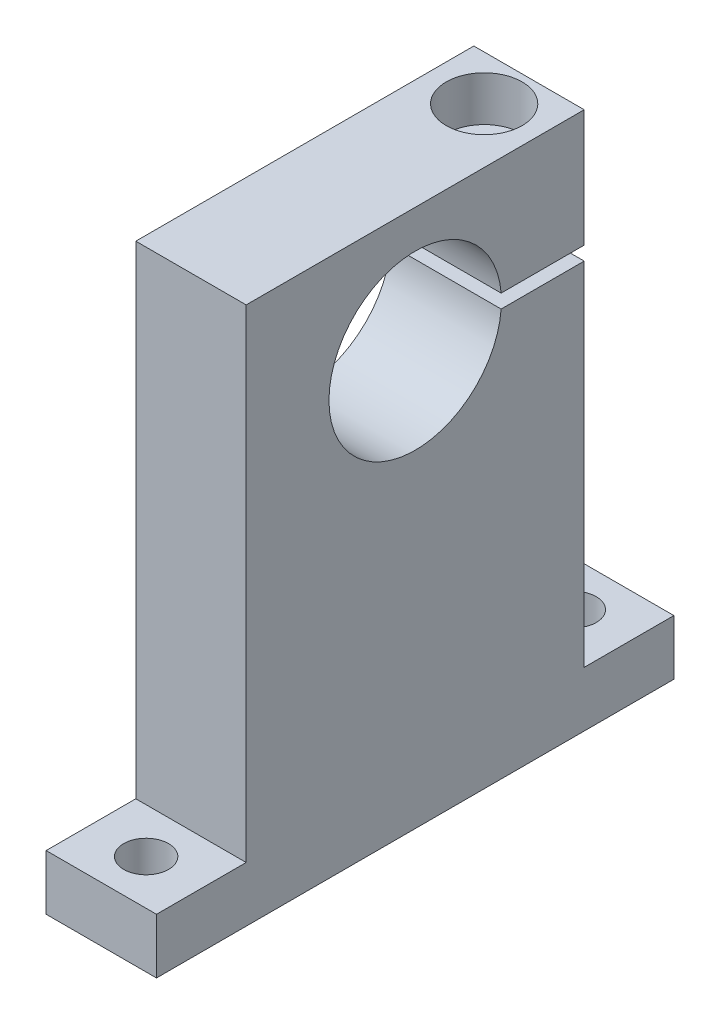
ISO-10303-21;
HEADER;
FILE_DESCRIPTION(('STEP AP214'),'2;1');
FILE_NAME('part.step','',(''),(''),'','','');
FILE_SCHEMA(('AUTOMOTIVE_DESIGN { 1 0 10303 214 1 1 1 1 }'));
ENDSEC;
DATA;
#1=APPLICATION_CONTEXT('core data for automotive mechanical design processes');
#2=APPLICATION_PROTOCOL_DEFINITION('international standard','automotive_design',2000,#1);
#3=PRODUCT_CONTEXT('',#1,'mechanical');
#4=PRODUCT('Part','Part','',(#3));
#5=PRODUCT_RELATED_PRODUCT_CATEGORY('part','',(#4));
#6=PRODUCT_DEFINITION_FORMATION('','',#4);
#7=PRODUCT_DEFINITION_CONTEXT('part definition',#1,'design');
#8=PRODUCT_DEFINITION('design','',#6,#7);
#9=PRODUCT_DEFINITION_SHAPE('','',#8);
#10=(LENGTH_UNIT() NAMED_UNIT(*) SI_UNIT(.MILLI.,.METRE.));
#11=(NAMED_UNIT(*) PLANE_ANGLE_UNIT() SI_UNIT($,.RADIAN.));
#12=(NAMED_UNIT(*) SI_UNIT($,.STERADIAN.) SOLID_ANGLE_UNIT());
#13=UNCERTAINTY_MEASURE_WITH_UNIT(LENGTH_MEASURE(1.E-05),#10,'distance_accuracy_value','');
#14=(GEOMETRIC_REPRESENTATION_CONTEXT(3) GLOBAL_UNCERTAINTY_ASSIGNED_CONTEXT((#13)) GLOBAL_UNIT_ASSIGNED_CONTEXT((#10,
#11,#12)) REPRESENTATION_CONTEXT('',''));
#15=CARTESIAN_POINT('',(0.,0.,0.));
#16=DIRECTION('',(0.,0.,1.));
#17=DIRECTION('',(1.,0.,0.));
#18=AXIS2_PLACEMENT_3D('',#15,#16,#17);
#19=CARTESIAN_POINT('',(0.,44.6,-18.));
#20=DIRECTION('',(0.,1.,0.));
#21=DIRECTION('',(0.,0.,1.));
#22=AXIS2_PLACEMENT_3D('',#19,#20,#21);
#23=CONICAL_SURFACE('',#22,2.4585,1.04719754999991);
#24=CARTESIAN_POINT('',(0.,44.6,-18.));
#25=DIRECTION('',(0.,1.,0.));
#26=DIRECTION('',(0.,0.,1.));
#27=AXIS2_PLACEMENT_3D('',#24,#25,#26);
#28=CIRCLE('',#27,2.4585);
#29=CARTESIAN_POINT('',(0.,44.6,-15.5415));
#30=VERTEX_POINT('',#29);
#31=EDGE_CURVE('E11',#30,#30,#28,.T.);
#32=ORIENTED_EDGE('',*,*,#31,.T.);
#33=EDGE_LOOP('',(#32));
#34=FACE_BOUND('',#33,.T.);
#35=CARTESIAN_POINT('',(0.,43.180584363197,-18.));
#36=VERTEX_POINT('',#35);
#37=VERTEX_LOOP('',#36);
#38=FACE_BOUND('',#37,.T.);
#39=ADVANCED_FACE('F17',(#34,#38),#23,.F.);
#40=CARTESIAN_POINT('',(0.,43.180584363197,-18.));
#41=DIRECTION('',(0.,1.,0.));
#42=DIRECTION('',(0.,0.,1.));
#43=AXIS2_PLACEMENT_3D('',#40,#41,#42);
#44=CYLINDRICAL_SURFACE('',#43,2.4585);
#45=CARTESIAN_POINT('',(0.,58.4585,-18.));
#46=DIRECTION('',(0.,1.,0.));
#47=DIRECTION('',(0.,0.,1.));
#48=AXIS2_PLACEMENT_3D('',#45,#46,#47);
#49=CIRCLE('',#48,2.4585);
#50=CARTESIAN_POINT('',(0.,58.4585,-15.5415));
#51=VERTEX_POINT('',#50);
#52=EDGE_CURVE('E28',#51,#51,#49,.T.);
#53=ORIENTED_EDGE('',*,*,#52,.T.);
#54=EDGE_LOOP('',(#53));
#55=FACE_BOUND('',#54,.T.);
#56=ORIENTED_EDGE('',*,*,#31,.F.);
#57=EDGE_LOOP('',(#56));
#58=FACE_BOUND('',#57,.T.);
#59=ADVANCED_FACE('F399',(#55,#58),#44,.F.);
#60=CARTESIAN_POINT('',(0.,59.,-18.));
#61=DIRECTION('',(0.,1.,0.));
#62=DIRECTION('',(0.,0.,1.));
#63=AXIS2_PLACEMENT_3D('',#60,#61,#62);
#64=CONICAL_SURFACE('',#63,3.,0.7853981625);
#65=CARTESIAN_POINT('',(0.,59.,-18.));
#66=DIRECTION('',(0.,1.,0.));
#67=DIRECTION('',(0.,0.,1.));
#68=AXIS2_PLACEMENT_3D('',#65,#66,#67);
#69=CIRCLE('',#68,3.);
#70=CARTESIAN_POINT('',(0.,59.,-15.));
#71=VERTEX_POINT('',#70);
#72=EDGE_CURVE('E271',#71,#71,#69,.T.);
#73=ORIENTED_EDGE('',*,*,#72,.T.);
#74=EDGE_LOOP('',(#73));
#75=FACE_BOUND('',#74,.T.);
#76=ORIENTED_EDGE('',*,*,#52,.F.);
#77=EDGE_LOOP('',(#76));
#78=FACE_BOUND('',#77,.T.);
#79=ADVANCED_FACE('F404',(#75,#78),#64,.F.);
#80=CARTESIAN_POINT('',(0.,71.5,-23.5));
#81=DIRECTION('',(0.,-1.,0.));
#82=DIRECTION('',(0.,0.,-1.));
#83=AXIS2_PLACEMENT_3D('',#80,#81,#82);
#84=PLANE('',#83);
#85=CARTESIAN_POINT('',(0.,71.5,-18.));
#86=DIRECTION('',(0.,1.,0.));
#87=DIRECTION('',(0.,0.,1.));
#88=AXIS2_PLACEMENT_3D('',#85,#86,#87);
#89=CIRCLE('',#88,5.5);
#90=CARTESIAN_POINT('',(0.,71.5,-12.5));
#91=VERTEX_POINT('',#90);
#92=EDGE_CURVE('E218',#91,#91,#89,.T.);
#93=ORIENTED_EDGE('',*,*,#92,.T.);
#94=EDGE_LOOP('',(#93));
#95=FACE_BOUND('',#94,.T.);
#96=CARTESIAN_POINT('',(0.,71.5,-18.));
#97=DIRECTION('',(0.,1.,0.));
#98=DIRECTION('',(0.,0.,1.));
#99=AXIS2_PLACEMENT_3D('',#96,#97,#98);
#100=CIRCLE('',#99,3.3);
#101=CARTESIAN_POINT('',(0.,71.5,-14.7));
#102=VERTEX_POINT('',#101);
#103=EDGE_CURVE('E221',#102,#102,#100,.T.);
#104=ORIENTED_EDGE('',*,*,#103,.F.);
#105=EDGE_LOOP('',(#104));
#106=FACE_BOUND('',#105,.T.);
#107=ADVANCED_FACE('F425',(#95,#106),#84,.F.);
#108=CARTESIAN_POINT('',(0.,60.,-18.));
#109=DIRECTION('',(0.,1.,0.));
#110=DIRECTION('',(0.,0.,1.));
#111=AXIS2_PLACEMENT_3D('',#108,#109,#110);
#112=CYLINDRICAL_SURFACE('',#111,5.5);
#113=CARTESIAN_POINT('',(0.,78.,-18.));
#114=DIRECTION('',(0.,1.,0.));
#115=DIRECTION('',(0.,0.,1.));
#116=AXIS2_PLACEMENT_3D('',#113,#114,#115);
#117=CIRCLE('',#116,5.5);
#118=CARTESIAN_POINT('',(0.,78.,-12.5));
#119=VERTEX_POINT('',#118);
#120=EDGE_CURVE('E208',#119,#119,#117,.T.);
#121=ORIENTED_EDGE('',*,*,#120,.T.);
#122=EDGE_LOOP('',(#121));
#123=FACE_BOUND('',#122,.T.);
#124=ORIENTED_EDGE('',*,*,#92,.F.);
#125=EDGE_LOOP('',(#124));
#126=FACE_BOUND('',#125,.T.);
#127=ADVANCED_FACE('F421',(#123,#126),#112,.F.);
#128=CARTESIAN_POINT('',(0.,60.,-18.));
#129=DIRECTION('',(0.,1.,0.));
#130=DIRECTION('',(0.,0.,1.));
#131=AXIS2_PLACEMENT_3D('',#128,#129,#130);
#132=CYLINDRICAL_SURFACE('',#131,3.3);
#133=CARTESIAN_POINT('',(0.,61.,-18.));
#134=DIRECTION('',(0.,1.,0.));
#135=DIRECTION('',(0.,0.,1.));
#136=AXIS2_PLACEMENT_3D('',#133,#134,#135);
#137=CIRCLE('',#136,3.3);
#138=CARTESIAN_POINT('',(0.,61.,-14.7));
#139=VERTEX_POINT('',#138);
#140=EDGE_CURVE('E211',#139,#139,#137,.T.);
#141=ORIENTED_EDGE('',*,*,#140,.F.);
#142=EDGE_LOOP('',(#141));
#143=FACE_BOUND('',#142,.T.);
#144=ORIENTED_EDGE('',*,*,#103,.T.);
#145=EDGE_LOOP('',(#144));
#146=FACE_BOUND('',#145,.T.);
#147=ADVANCED_FACE('F424',(#143,#146),#132,.F.);
#148=CARTESIAN_POINT('',(0.,8.,31.));
#149=DIRECTION('',(0.,-1.,0.));
#150=DIRECTION('',(0.,0.,-1.));
#151=AXIS2_PLACEMENT_3D('',#148,#149,#150);
#152=CYLINDRICAL_SURFACE('',#151,3.25);
#153=CARTESIAN_POINT('',(0.,0.,31.));
#154=DIRECTION('',(0.,1.,0.));
#155=DIRECTION('',(1.,0.,0.));
#156=AXIS2_PLACEMENT_3D('',#153,#154,#155);
#157=CIRCLE('',#156,3.25);
#158=CARTESIAN_POINT('',(3.25,0.,31.));
#159=VERTEX_POINT('',#158);
#160=EDGE_CURVE('E246',#159,#159,#157,.T.);
#161=ORIENTED_EDGE('',*,*,#160,.F.);
#162=EDGE_LOOP('',(#161));
#163=FACE_BOUND('',#162,.T.);
#164=CARTESIAN_POINT('',(0.,8.,31.));
#165=DIRECTION('',(0.,1.,0.));
#166=DIRECTION('',(1.,0.,0.));
#167=AXIS2_PLACEMENT_3D('',#164,#165,#166);
#168=CIRCLE('',#167,3.25);
#169=CARTESIAN_POINT('',(3.25,8.,31.));
#170=VERTEX_POINT('',#169);
#171=EDGE_CURVE('E236',#170,#170,#168,.T.);
#172=ORIENTED_EDGE('',*,*,#171,.T.);
#173=EDGE_LOOP('',(#172));
#174=FACE_BOUND('',#173,.T.);
#175=ADVANCED_FACE('F385',(#163,#174),#152,.F.);
#176=CARTESIAN_POINT('',(0.,8.,-31.));
#177=DIRECTION('',(0.,-1.,0.));
#178=DIRECTION('',(0.,0.,-1.));
#179=AXIS2_PLACEMENT_3D('',#176,#177,#178);
#180=CYLINDRICAL_SURFACE('',#179,3.25);
#181=CARTESIAN_POINT('',(0.,0.,-31.));
#182=DIRECTION('',(0.,1.,0.));
#183=DIRECTION('',(1.,0.,0.));
#184=AXIS2_PLACEMENT_3D('',#181,#182,#183);
#185=CIRCLE('',#184,3.25);
#186=CARTESIAN_POINT('',(3.25,0.,-31.));
#187=VERTEX_POINT('',#186);
#188=EDGE_CURVE('E257',#187,#187,#185,.T.);
#189=ORIENTED_EDGE('',*,*,#188,.F.);
#190=EDGE_LOOP('',(#189));
#191=FACE_BOUND('',#190,.T.);
#192=CARTESIAN_POINT('',(0.,8.,-31.));
#193=DIRECTION('',(0.,1.,0.));
#194=DIRECTION('',(1.,0.,0.));
#195=AXIS2_PLACEMENT_3D('',#192,#193,#194);
#196=CIRCLE('',#195,3.25);
#197=CARTESIAN_POINT('',(3.25,8.,-31.));
#198=VERTEX_POINT('',#197);
#199=EDGE_CURVE('E277',#198,#198,#196,.T.);
#200=ORIENTED_EDGE('',*,*,#199,.T.);
#201=EDGE_LOOP('',(#200));
#202=FACE_BOUND('',#201,.T.);
#203=ADVANCED_FACE('F409',(#191,#202),#180,.F.);
#204=CARTESIAN_POINT('',(-8.,60.,0.));
#205=DIRECTION('',(1.,0.,0.));
#206=DIRECTION('',(0.,1.,0.));
#207=AXIS2_PLACEMENT_3D('',#204,#205,#206);
#208=PLANE('',#207);
#209=DIRECTION('',(0.,0.,1.));
#210=VECTOR('',#209,1.);
#211=CARTESIAN_POINT('',(-8.,8.,-37.5));
#212=LINE('',#211,#210);
#213=CARTESIAN_POINT('',(-8.,8.,-37.5));
#214=VERTEX_POINT('',#213);
#215=CARTESIAN_POINT('',(-8.,8.,-24.5));
#216=VERTEX_POINT('',#215);
#217=EDGE_CURVE('E232',#214,#216,#212,.T.);
#218=ORIENTED_EDGE('',*,*,#217,.F.);
#219=DIRECTION('',(0.,1.,0.));
#220=VECTOR('',#219,1.);
#221=CARTESIAN_POINT('',(-8.,0.,-37.5));
#222=LINE('',#221,#220);
#223=CARTESIAN_POINT('',(-8.,0.,-37.5));
#224=VERTEX_POINT('',#223);
#225=EDGE_CURVE('E217',#224,#214,#222,.T.);
#226=ORIENTED_EDGE('',*,*,#225,.F.);
#227=DIRECTION('',(0.,0.,-1.));
#228=VECTOR('',#227,1.);
#229=CARTESIAN_POINT('',(-8.,0.,37.5));
#230=LINE('',#229,#228);
#231=CARTESIAN_POINT('',(-8.,0.,37.5));
#232=VERTEX_POINT('',#231);
#233=EDGE_CURVE('E249',#232,#224,#230,.T.);
#234=ORIENTED_EDGE('',*,*,#233,.F.);
#235=DIRECTION('',(0.,-1.,0.));
#236=VECTOR('',#235,1.);
#237=CARTESIAN_POINT('',(-8.,8.,37.5));
#238=LINE('',#237,#236);
#239=CARTESIAN_POINT('',(-8.,8.,37.5));
#240=VERTEX_POINT('',#239);
#241=EDGE_CURVE('E185',#240,#232,#238,.T.);
#242=ORIENTED_EDGE('',*,*,#241,.F.);
#243=DIRECTION('',(0.,0.,1.));
#244=VECTOR('',#243,1.);
#245=CARTESIAN_POINT('',(-8.,8.,24.5));
#246=LINE('',#245,#244);
#247=CARTESIAN_POINT('',(-8.,8.,24.5));
#248=VERTEX_POINT('',#247);
#249=EDGE_CURVE('E289',#248,#240,#246,.T.);
#250=ORIENTED_EDGE('',*,*,#249,.F.);
#251=DIRECTION('',(0.,-1.,0.));
#252=VECTOR('',#251,1.);
#253=CARTESIAN_POINT('',(-8.,78.,24.5));
#254=LINE('',#253,#252);
#255=CARTESIAN_POINT('',(-8.,78.,24.5));
#256=VERTEX_POINT('',#255);
#257=EDGE_CURVE('E186',#256,#248,#254,.T.);
#258=ORIENTED_EDGE('',*,*,#257,.F.);
#259=DIRECTION('',(0.,0.,1.));
#260=VECTOR('',#259,1.);
#261=CARTESIAN_POINT('',(-8.,78.,-24.5));
#262=LINE('',#261,#260);
#263=CARTESIAN_POINT('',(-8.,78.,-24.5));
#264=VERTEX_POINT('',#263);
#265=EDGE_CURVE('E202',#264,#256,#262,.T.);
#266=ORIENTED_EDGE('',*,*,#265,.F.);
#267=DIRECTION('',(0.,1.,0.));
#268=VECTOR('',#267,1.);
#269=CARTESIAN_POINT('',(-8.,61.,-24.5));
#270=LINE('',#269,#268);
#271=CARTESIAN_POINT('',(-8.,61.,-24.5));
#272=VERTEX_POINT('',#271);
#273=EDGE_CURVE('E222',#272,#264,#270,.T.);
#274=ORIENTED_EDGE('',*,*,#273,.F.);
#275=DIRECTION('',(0.,0.,-1.));
#276=VECTOR('',#275,1.);
#277=CARTESIAN_POINT('',(-8.,61.,-12.459935794377));
#278=LINE('',#277,#276);
#279=CARTESIAN_POINT('',(-8.,61.,-12.459935794377));
#280=VERTEX_POINT('',#279);
#281=EDGE_CURVE('E263',#280,#272,#278,.T.);
#282=ORIENTED_EDGE('',*,*,#281,.F.);
#283=CARTESIAN_POINT('',(-8.,60.,0.));
#284=DIRECTION('',(1.,0.,0.));
#285=DIRECTION('',(0.,1.,0.));
#286=AXIS2_PLACEMENT_3D('',#283,#284,#285);
#287=CIRCLE('',#286,12.5);
#288=CARTESIAN_POINT('',(-8.,59.,-12.459935794377));
#289=VERTEX_POINT('',#288);
#290=EDGE_CURVE('E287',#280,#289,#287,.T.);
#291=ORIENTED_EDGE('',*,*,#290,.T.);
#292=DIRECTION('',(0.,0.,1.));
#293=VECTOR('',#292,1.);
#294=CARTESIAN_POINT('',(-8.,59.,-24.5));
#295=LINE('',#294,#293);
#296=CARTESIAN_POINT('',(-8.,59.,-24.5));
#297=VERTEX_POINT('',#296);
#298=EDGE_CURVE('E266',#297,#289,#295,.T.);
#299=ORIENTED_EDGE('',*,*,#298,.F.);
#300=DIRECTION('',(0.,1.,0.));
#301=VECTOR('',#300,1.);
#302=CARTESIAN_POINT('',(-8.,8.,-24.5));
#303=LINE('',#302,#301);
#304=EDGE_CURVE('E272',#216,#297,#303,.T.);
#305=ORIENTED_EDGE('',*,*,#304,.F.);
#306=EDGE_LOOP('',(#218,#226,#234,#242,#250,#258,#266,#274,#282,#291,#299,#305));
#307=FACE_BOUND('',#306,.T.);
#308=ADVANCED_FACE('F355',(#307),#208,.F.);
#309=CARTESIAN_POINT('',(8.,60.,0.));
#310=DIRECTION('',(1.,0.,0.));
#311=DIRECTION('',(0.,1.,0.));
#312=AXIS2_PLACEMENT_3D('',#309,#310,#311);
#313=PLANE('',#312);
#314=DIRECTION('',(0.,0.,1.));
#315=VECTOR('',#314,1.);
#316=CARTESIAN_POINT('',(8.,8.,-37.5));
#317=LINE('',#316,#315);
#318=CARTESIAN_POINT('',(8.,8.,-37.5));
#319=VERTEX_POINT('',#318);
#320=CARTESIAN_POINT('',(8.,8.,-24.5));
#321=VERTEX_POINT('',#320);
#322=EDGE_CURVE('E315',#319,#321,#317,.T.);
#323=ORIENTED_EDGE('',*,*,#322,.T.);
#324=DIRECTION('',(0.,1.,0.));
#325=VECTOR('',#324,1.);
#326=CARTESIAN_POINT('',(8.,8.,-24.5));
#327=LINE('',#326,#325);
#328=CARTESIAN_POINT('',(8.,59.,-24.5));
#329=VERTEX_POINT('',#328);
#330=EDGE_CURVE('E281',#321,#329,#327,.T.);
#331=ORIENTED_EDGE('',*,*,#330,.T.);
#332=DIRECTION('',(0.,0.,1.));
#333=VECTOR('',#332,1.);
#334=CARTESIAN_POINT('',(8.,59.,-24.5));
#335=LINE('',#334,#333);
#336=CARTESIAN_POINT('',(8.,59.,-12.459935794377));
#337=VERTEX_POINT('',#336);
#338=EDGE_CURVE('E290',#329,#337,#335,.T.);
#339=ORIENTED_EDGE('',*,*,#338,.T.);
#340=CARTESIAN_POINT('',(8.,60.,0.));
#341=DIRECTION('',(1.,0.,0.));
#342=DIRECTION('',(0.,1.,0.));
#343=AXIS2_PLACEMENT_3D('',#340,#341,#342);
#344=CIRCLE('',#343,12.5);
#345=CARTESIAN_POINT('',(8.,61.,-12.459935794377));
#346=VERTEX_POINT('',#345);
#347=EDGE_CURVE('E286',#346,#337,#344,.T.);
#348=ORIENTED_EDGE('',*,*,#347,.F.);
#349=DIRECTION('',(0.,0.,-1.));
#350=VECTOR('',#349,1.);
#351=CARTESIAN_POINT('',(8.,61.,-12.459935794377));
#352=LINE('',#351,#350);
#353=CARTESIAN_POINT('',(8.,61.,-24.5));
#354=VERTEX_POINT('',#353);
#355=EDGE_CURVE('E227',#346,#354,#352,.T.);
#356=ORIENTED_EDGE('',*,*,#355,.T.);
#357=DIRECTION('',(0.,1.,0.));
#358=VECTOR('',#357,1.);
#359=CARTESIAN_POINT('',(8.,61.,-24.5));
#360=LINE('',#359,#358);
#361=CARTESIAN_POINT('',(8.,78.,-24.5));
#362=VERTEX_POINT('',#361);
#363=EDGE_CURVE('E194',#354,#362,#360,.T.);
#364=ORIENTED_EDGE('',*,*,#363,.T.);
#365=DIRECTION('',(0.,0.,1.));
#366=VECTOR('',#365,1.);
#367=CARTESIAN_POINT('',(8.,78.,-24.5));
#368=LINE('',#367,#366);
#369=CARTESIAN_POINT('',(8.,78.,24.5));
#370=VERTEX_POINT('',#369);
#371=EDGE_CURVE('E190',#362,#370,#368,.T.);
#372=ORIENTED_EDGE('',*,*,#371,.T.);
#373=DIRECTION('',(0.,-1.,0.));
#374=VECTOR('',#373,1.);
#375=CARTESIAN_POINT('',(8.,78.,24.5));
#376=LINE('',#375,#374);
#377=CARTESIAN_POINT('',(8.,8.,24.5));
#378=VERTEX_POINT('',#377);
#379=EDGE_CURVE('E173',#370,#378,#376,.T.);
#380=ORIENTED_EDGE('',*,*,#379,.T.);
#381=DIRECTION('',(0.,0.,1.));
#382=VECTOR('',#381,1.);
#383=CARTESIAN_POINT('',(8.,8.,24.5));
#384=LINE('',#383,#382);
#385=CARTESIAN_POINT('',(8.,8.,37.5));
#386=VERTEX_POINT('',#385);
#387=EDGE_CURVE('E228',#378,#386,#384,.T.);
#388=ORIENTED_EDGE('',*,*,#387,.T.);
#389=DIRECTION('',(0.,-1.,0.));
#390=VECTOR('',#389,1.);
#391=CARTESIAN_POINT('',(8.,8.,37.5));
#392=LINE('',#391,#390);
#393=CARTESIAN_POINT('',(8.,0.,37.5));
#394=VERTEX_POINT('',#393);
#395=EDGE_CURVE('E214',#386,#394,#392,.T.);
#396=ORIENTED_EDGE('',*,*,#395,.T.);
#397=DIRECTION('',(0.,0.,-1.));
#398=VECTOR('',#397,1.);
#399=CARTESIAN_POINT('',(8.,0.,37.5));
#400=LINE('',#399,#398);
#401=CARTESIAN_POINT('',(8.,0.,-37.5));
#402=VERTEX_POINT('',#401);
#403=EDGE_CURVE('E237',#394,#402,#400,.T.);
#404=ORIENTED_EDGE('',*,*,#403,.T.);
#405=DIRECTION('',(0.,1.,0.));
#406=VECTOR('',#405,1.);
#407=CARTESIAN_POINT('',(8.,0.,-37.5));
#408=LINE('',#407,#406);
#409=EDGE_CURVE('E311',#402,#319,#408,.T.);
#410=ORIENTED_EDGE('',*,*,#409,.T.);
#411=EDGE_LOOP('',(#323,#331,#339,#348,#356,#364,#372,#380,#388,#396,#404,#410));
#412=FACE_BOUND('',#411,.T.);
#413=ADVANCED_FACE('F192',(#412),#313,.T.);
#414=CARTESIAN_POINT('',(8.,0.,-37.5));
#415=DIRECTION('',(0.,0.,1.));
#416=DIRECTION('',(1.,0.,0.));
#417=AXIS2_PLACEMENT_3D('',#414,#415,#416);
#418=PLANE('',#417);
#419=ORIENTED_EDGE('',*,*,#225,.T.);
#420=DIRECTION('',(-1.,0.,0.));
#421=VECTOR('',#420,1.);
#422=CARTESIAN_POINT('',(8.,8.,-37.5));
#423=LINE('',#422,#421);
#424=EDGE_CURVE('E324',#319,#214,#423,.T.);
#425=ORIENTED_EDGE('',*,*,#424,.F.);
#426=ORIENTED_EDGE('',*,*,#409,.F.);
#427=DIRECTION('',(-1.,0.,0.));
#428=VECTOR('',#427,1.);
#429=CARTESIAN_POINT('',(8.,0.,-37.5));
#430=LINE('',#429,#428);
#431=EDGE_CURVE('E240',#402,#224,#430,.T.);
#432=ORIENTED_EDGE('',*,*,#431,.T.);
#433=EDGE_LOOP('',(#419,#425,#426,#432));
#434=FACE_BOUND('',#433,.T.);
#435=ADVANCED_FACE('F357',(#434),#418,.F.);
#436=CARTESIAN_POINT('',(8.,8.,37.5));
#437=DIRECTION('',(0.,0.,-1.));
#438=DIRECTION('',(0.,-1.,0.));
#439=AXIS2_PLACEMENT_3D('',#436,#437,#438);
#440=PLANE('',#439);
#441=ORIENTED_EDGE('',*,*,#241,.T.);
#442=DIRECTION('',(-1.,0.,0.));
#443=VECTOR('',#442,1.);
#444=CARTESIAN_POINT('',(8.,0.,37.5));
#445=LINE('',#444,#443);
#446=EDGE_CURVE('E21',#394,#232,#445,.T.);
#447=ORIENTED_EDGE('',*,*,#446,.F.);
#448=ORIENTED_EDGE('',*,*,#395,.F.);
#449=DIRECTION('',(-1.,0.,0.));
#450=VECTOR('',#449,1.);
#451=CARTESIAN_POINT('',(8.,8.,37.5));
#452=LINE('',#451,#450);
#453=EDGE_CURVE('E231',#386,#240,#452,.T.);
#454=ORIENTED_EDGE('',*,*,#453,.T.);
#455=EDGE_LOOP('',(#441,#447,#448,#454));
#456=FACE_BOUND('',#455,.T.);
#457=ADVANCED_FACE('F345',(#456),#440,.F.);
#458=CARTESIAN_POINT('',(8.,78.,24.5));
#459=DIRECTION('',(0.,0.,-1.));
#460=DIRECTION('',(0.,-1.,0.));
#461=AXIS2_PLACEMENT_3D('',#458,#459,#460);
#462=PLANE('',#461);
#463=ORIENTED_EDGE('',*,*,#257,.T.);
#464=DIRECTION('',(-1.,0.,0.));
#465=VECTOR('',#464,1.);
#466=CARTESIAN_POINT('',(8.,8.,24.5));
#467=LINE('',#466,#465);
#468=EDGE_CURVE('E180',#378,#248,#467,.T.);
#469=ORIENTED_EDGE('',*,*,#468,.F.);
#470=ORIENTED_EDGE('',*,*,#379,.F.);
#471=DIRECTION('',(-1.,0.,0.));
#472=VECTOR('',#471,1.);
#473=CARTESIAN_POINT('',(8.,78.,24.5));
#474=LINE('',#473,#472);
#475=EDGE_CURVE('E177',#370,#256,#474,.T.);
#476=ORIENTED_EDGE('',*,*,#475,.T.);
#477=EDGE_LOOP('',(#463,#469,#470,#476));
#478=FACE_BOUND('',#477,.T.);
#479=ADVANCED_FACE('F175',(#478),#462,.F.);
#480=CARTESIAN_POINT('',(8.,78.,-24.5));
#481=DIRECTION('',(0.,-1.,0.));
#482=DIRECTION('',(0.,0.,-1.));
#483=AXIS2_PLACEMENT_3D('',#480,#481,#482);
#484=PLANE('',#483);
#485=ORIENTED_EDGE('',*,*,#265,.T.);
#486=ORIENTED_EDGE('',*,*,#475,.F.);
#487=ORIENTED_EDGE('',*,*,#371,.F.);
#488=DIRECTION('',(-1.,0.,0.));
#489=VECTOR('',#488,1.);
#490=CARTESIAN_POINT('',(8.,78.,-24.5));
#491=LINE('',#490,#489);
#492=EDGE_CURVE('E226',#362,#264,#491,.T.);
#493=ORIENTED_EDGE('',*,*,#492,.T.);
#494=EDGE_LOOP('',(#485,#486,#487,#493));
#495=FACE_BOUND('',#494,.T.);
#496=ORIENTED_EDGE('',*,*,#120,.F.);
#497=EDGE_LOOP('',(#496));
#498=FACE_BOUND('',#497,.T.);
#499=ADVANCED_FACE('F200',(#495,#498),#484,.F.);
#500=CARTESIAN_POINT('',(8.,61.,-24.5));
#501=DIRECTION('',(0.,0.,1.));
#502=DIRECTION('',(1.,0.,0.));
#503=AXIS2_PLACEMENT_3D('',#500,#501,#502);
#504=PLANE('',#503);
#505=ORIENTED_EDGE('',*,*,#273,.T.);
#506=ORIENTED_EDGE('',*,*,#492,.F.);
#507=ORIENTED_EDGE('',*,*,#363,.F.);
#508=DIRECTION('',(-1.,0.,0.));
#509=VECTOR('',#508,1.);
#510=CARTESIAN_POINT('',(8.,61.,-24.5));
#511=LINE('',#510,#509);
#512=EDGE_CURVE('E261',#354,#272,#511,.T.);
#513=ORIENTED_EDGE('',*,*,#512,.T.);
#514=EDGE_LOOP('',(#505,#506,#507,#513));
#515=FACE_BOUND('',#514,.T.);
#516=ADVANCED_FACE('F415',(#515),#504,.F.);
#517=CARTESIAN_POINT('',(8.,61.,-12.459935794377));
#518=DIRECTION('',(0.,1.,0.));
#519=DIRECTION('',(1.,0.,0.));
#520=AXIS2_PLACEMENT_3D('',#517,#518,#519);
#521=PLANE('',#520);
#522=ORIENTED_EDGE('',*,*,#281,.T.);
#523=ORIENTED_EDGE('',*,*,#512,.F.);
#524=ORIENTED_EDGE('',*,*,#355,.F.);
#525=DIRECTION('',(-1.,0.,0.));
#526=VECTOR('',#525,1.);
#527=CARTESIAN_POINT('',(8.,61.,-12.459935794377));
#528=LINE('',#527,#526);
#529=EDGE_CURVE('E282',#346,#280,#528,.T.);
#530=ORIENTED_EDGE('',*,*,#529,.T.);
#531=EDGE_LOOP('',(#522,#523,#524,#530));
#532=FACE_BOUND('',#531,.T.);
#533=ORIENTED_EDGE('',*,*,#140,.T.);
#534=EDGE_LOOP('',(#533));
#535=FACE_BOUND('',#534,.T.);
#536=ADVANCED_FACE('F411',(#532,#535),#521,.F.);
#537=CARTESIAN_POINT('',(8.,60.,0.));
#538=DIRECTION('',(-1.,0.,0.));
#539=DIRECTION('',(0.,0.,1.));
#540=AXIS2_PLACEMENT_3D('',#537,#538,#539);
#541=CYLINDRICAL_SURFACE('',#540,12.5);
#542=ORIENTED_EDGE('',*,*,#290,.F.);
#543=ORIENTED_EDGE('',*,*,#529,.F.);
#544=ORIENTED_EDGE('',*,*,#347,.T.);
#545=DIRECTION('',(-1.,0.,0.));
#546=VECTOR('',#545,1.);
#547=CARTESIAN_POINT('',(8.,59.,-12.459935794377));
#548=LINE('',#547,#546);
#549=EDGE_CURVE('E270',#337,#289,#548,.T.);
#550=ORIENTED_EDGE('',*,*,#549,.T.);
#551=EDGE_LOOP('',(#542,#543,#544,#550));
#552=FACE_BOUND('',#551,.T.);
#553=ADVANCED_FACE('F414',(#552),#541,.F.);
#554=CARTESIAN_POINT('',(8.,59.,-24.5));
#555=DIRECTION('',(0.,-1.,0.));
#556=DIRECTION('',(0.,0.,-1.));
#557=AXIS2_PLACEMENT_3D('',#554,#555,#556);
#558=PLANE('',#557);
#559=ORIENTED_EDGE('',*,*,#298,.T.);
#560=ORIENTED_EDGE('',*,*,#549,.F.);
#561=ORIENTED_EDGE('',*,*,#338,.F.);
#562=DIRECTION('',(-1.,0.,0.));
#563=VECTOR('',#562,1.);
#564=CARTESIAN_POINT('',(8.,59.,-24.5));
#565=LINE('',#564,#563);
#566=EDGE_CURVE('E276',#329,#297,#565,.T.);
#567=ORIENTED_EDGE('',*,*,#566,.T.);
#568=EDGE_LOOP('',(#559,#560,#561,#567));
#569=FACE_BOUND('',#568,.T.);
#570=ORIENTED_EDGE('',*,*,#72,.F.);
#571=EDGE_LOOP('',(#570));
#572=FACE_BOUND('',#571,.T.);
#573=ADVANCED_FACE('F427',(#569,#572),#558,.F.);
#574=CARTESIAN_POINT('',(8.,8.,-24.5));
#575=DIRECTION('',(0.,0.,1.));
#576=DIRECTION('',(1.,0.,0.));
#577=AXIS2_PLACEMENT_3D('',#574,#575,#576);
#578=PLANE('',#577);
#579=ORIENTED_EDGE('',*,*,#304,.T.);
#580=ORIENTED_EDGE('',*,*,#566,.F.);
#581=ORIENTED_EDGE('',*,*,#330,.F.);
#582=DIRECTION('',(-1.,0.,0.));
#583=VECTOR('',#582,1.);
#584=CARTESIAN_POINT('',(8.,8.,-24.5));
#585=LINE('',#584,#583);
#586=EDGE_CURVE('E235',#321,#216,#585,.T.);
#587=ORIENTED_EDGE('',*,*,#586,.T.);
#588=EDGE_LOOP('',(#579,#580,#581,#587));
#589=FACE_BOUND('',#588,.T.);
#590=ADVANCED_FACE('F395',(#589),#578,.F.);
#591=CARTESIAN_POINT('',(8.,8.,-37.5));
#592=DIRECTION('',(0.,-1.,0.));
#593=DIRECTION('',(0.,0.,-1.));
#594=AXIS2_PLACEMENT_3D('',#591,#592,#593);
#595=PLANE('',#594);
#596=ORIENTED_EDGE('',*,*,#199,.F.);
#597=EDGE_LOOP('',(#596));
#598=FACE_BOUND('',#597,.T.);
#599=ORIENTED_EDGE('',*,*,#217,.T.);
#600=ORIENTED_EDGE('',*,*,#586,.F.);
#601=ORIENTED_EDGE('',*,*,#322,.F.);
#602=ORIENTED_EDGE('',*,*,#424,.T.);
#603=EDGE_LOOP('',(#599,#600,#601,#602));
#604=FACE_BOUND('',#603,.T.);
#605=ADVANCED_FACE('F360',(#598,#604),#595,.F.);
#606=CARTESIAN_POINT('',(8.,8.,24.5));
#607=DIRECTION('',(0.,-1.,0.));
#608=DIRECTION('',(0.,0.,-1.));
#609=AXIS2_PLACEMENT_3D('',#606,#607,#608);
#610=PLANE('',#609);
#611=ORIENTED_EDGE('',*,*,#171,.F.);
#612=EDGE_LOOP('',(#611));
#613=FACE_BOUND('',#612,.T.);
#614=ORIENTED_EDGE('',*,*,#249,.T.);
#615=ORIENTED_EDGE('',*,*,#453,.F.);
#616=ORIENTED_EDGE('',*,*,#387,.F.);
#617=ORIENTED_EDGE('',*,*,#468,.T.);
#618=EDGE_LOOP('',(#614,#615,#616,#617));
#619=FACE_BOUND('',#618,.T.);
#620=ADVANCED_FACE('F19',(#613,#619),#610,.F.);
#621=CARTESIAN_POINT('',(8.,0.,37.5));
#622=DIRECTION('',(0.,1.,0.));
#623=DIRECTION('',(1.,0.,0.));
#624=AXIS2_PLACEMENT_3D('',#621,#622,#623);
#625=PLANE('',#624);
#626=ORIENTED_EDGE('',*,*,#160,.T.);
#627=EDGE_LOOP('',(#626));
#628=FACE_BOUND('',#627,.T.);
#629=ORIENTED_EDGE('',*,*,#233,.T.);
#630=ORIENTED_EDGE('',*,*,#431,.F.);
#631=ORIENTED_EDGE('',*,*,#403,.F.);
#632=ORIENTED_EDGE('',*,*,#446,.T.);
#633=EDGE_LOOP('',(#629,#630,#631,#632));
#634=FACE_BOUND('',#633,.T.);
#635=ORIENTED_EDGE('',*,*,#188,.T.);
#636=EDGE_LOOP('',(#635));
#637=FACE_BOUND('',#636,.T.);
#638=ADVANCED_FACE('F352',(#628,#634,#637),#625,.F.);
#639=CLOSED_SHELL('',(#39,#59,#79,#107,#127,#147,#175,#203,#308,#413,#435,#457,#479,#499,#516,
#536,#553,#573,#590,#605,#620,#638));
#640=MANIFOLD_SOLID_BREP('B1',#639);
#641=ADVANCED_BREP_SHAPE_REPRESENTATION('',(#18,#640),#14);
#642=SHAPE_DEFINITION_REPRESENTATION(#9,#641);
ENDSEC;
END-ISO-10303-21;
